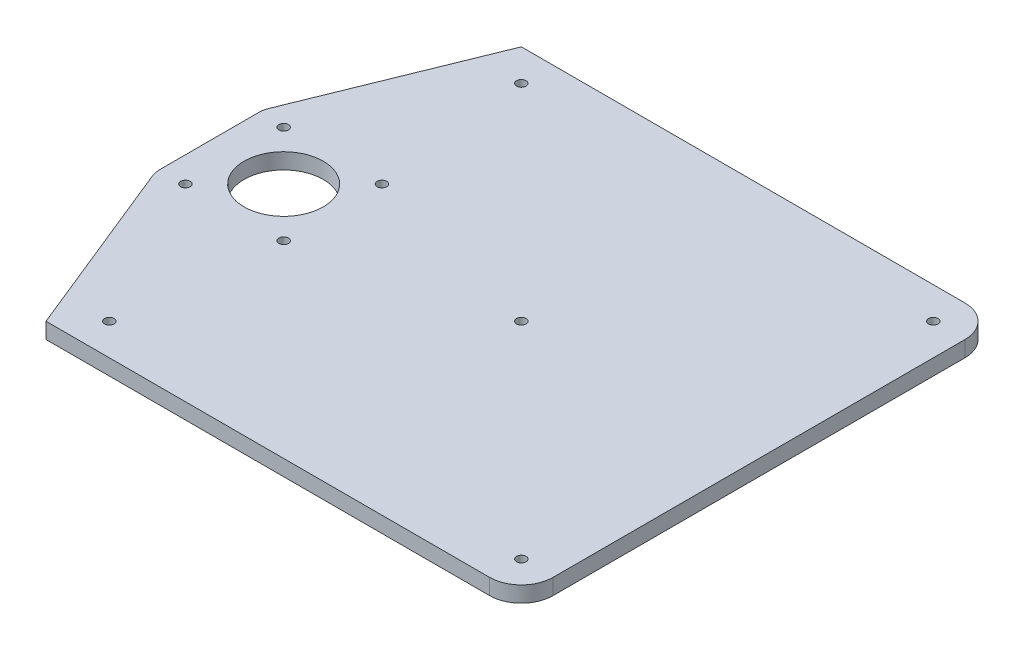
ISO-10303-21;
HEADER;
FILE_DESCRIPTION(('STEP AP214'),'2;1');
FILE_NAME('part.step','',(''),(''),'','','');
FILE_SCHEMA(('AUTOMOTIVE_DESIGN { 1 0 10303 214 1 1 1 1 }'));
ENDSEC;
DATA;
#1=APPLICATION_CONTEXT('core data for automotive mechanical design processes');
#2=APPLICATION_PROTOCOL_DEFINITION('international standard','automotive_design',2000,#1);
#3=PRODUCT_CONTEXT('',#1,'mechanical');
#4=PRODUCT('Part','Part','',(#3));
#5=PRODUCT_RELATED_PRODUCT_CATEGORY('part','',(#4));
#6=PRODUCT_DEFINITION_FORMATION('','',#4);
#7=PRODUCT_DEFINITION_CONTEXT('part definition',#1,'design');
#8=PRODUCT_DEFINITION('design','',#6,#7);
#9=PRODUCT_DEFINITION_SHAPE('','',#8);
#10=(LENGTH_UNIT() NAMED_UNIT(*) SI_UNIT(.MILLI.,.METRE.));
#11=(NAMED_UNIT(*) PLANE_ANGLE_UNIT() SI_UNIT($,.RADIAN.));
#12=(NAMED_UNIT(*) SI_UNIT($,.STERADIAN.) SOLID_ANGLE_UNIT());
#13=UNCERTAINTY_MEASURE_WITH_UNIT(LENGTH_MEASURE(1.E-05),#10,'distance_accuracy_value','');
#14=(GEOMETRIC_REPRESENTATION_CONTEXT(3) GLOBAL_UNCERTAINTY_ASSIGNED_CONTEXT((#13)) GLOBAL_UNIT_ASSIGNED_CONTEXT((#10,
#11,#12)) REPRESENTATION_CONTEXT('',''));
#15=CARTESIAN_POINT('',(0.,0.,0.));
#16=DIRECTION('',(0.,0.,1.));
#17=DIRECTION('',(1.,0.,0.));
#18=AXIS2_PLACEMENT_3D('',#15,#16,#17);
#19=CARTESIAN_POINT('',(65.,5.,65.));
#20=DIRECTION('',(0.,1.,0.));
#21=DIRECTION('',(0.,0.,1.));
#22=AXIS2_PLACEMENT_3D('',#19,#20,#21);
#23=PLANE('',#22);
#24=CARTESIAN_POINT('',(-65.,5.,65.));
#25=DIRECTION('',(0.,1.,0.));
#26=DIRECTION('',(0.,0.,1.));
#27=AXIS2_PLACEMENT_3D('',#24,#25,#26);
#28=CIRCLE('',#27,1.5);
#29=CARTESIAN_POINT('',(-65.,5.,66.5));
#30=VERTEX_POINT('',#29);
#31=EDGE_CURVE('E305',#30,#30,#28,.T.);
#32=ORIENTED_EDGE('',*,*,#31,.F.);
#33=EDGE_LOOP('',(#32));
#34=FACE_BOUND('',#33,.T.);
#35=CARTESIAN_POINT('',(65.,5.,-65.));
#36=DIRECTION('',(0.,1.,0.));
#37=DIRECTION('',(0.,0.,1.));
#38=AXIS2_PLACEMENT_3D('',#35,#36,#37);
#39=CIRCLE('',#38,1.5);
#40=CARTESIAN_POINT('',(65.,5.,-63.5));
#41=VERTEX_POINT('',#40);
#42=EDGE_CURVE('E289',#41,#41,#39,.T.);
#43=ORIENTED_EDGE('',*,*,#42,.F.);
#44=EDGE_LOOP('',(#43));
#45=FACE_BOUND('',#44,.T.);
#46=CARTESIAN_POINT('',(-65.,5.,-65.));
#47=DIRECTION('',(0.,1.,0.));
#48=DIRECTION('',(0.,0.,1.));
#49=AXIS2_PLACEMENT_3D('',#46,#47,#48);
#50=CIRCLE('',#49,1.5);
#51=CARTESIAN_POINT('',(-65.,5.,-63.5));
#52=VERTEX_POINT('',#51);
#53=EDGE_CURVE('E273',#52,#52,#50,.T.);
#54=ORIENTED_EDGE('',*,*,#53,.F.);
#55=EDGE_LOOP('',(#54));
#56=FACE_BOUND('',#55,.T.);
#57=CARTESIAN_POINT('',(-59.5,5.,15.5));
#58=DIRECTION('',(0.,1.,0.));
#59=DIRECTION('',(0.,0.,1.));
#60=AXIS2_PLACEMENT_3D('',#57,#58,#59);
#61=CIRCLE('',#60,1.5);
#62=CARTESIAN_POINT('',(-59.5,5.,17.));
#63=VERTEX_POINT('',#62);
#64=EDGE_CURVE('E257',#63,#63,#61,.T.);
#65=ORIENTED_EDGE('',*,*,#64,.F.);
#66=EDGE_LOOP('',(#65));
#67=FACE_BOUND('',#66,.T.);
#68=CARTESIAN_POINT('',(-90.5,5.,-15.5));
#69=DIRECTION('',(0.,1.,0.));
#70=DIRECTION('',(0.,0.,1.));
#71=AXIS2_PLACEMENT_3D('',#68,#69,#70);
#72=CIRCLE('',#71,1.5);
#73=CARTESIAN_POINT('',(-90.5,5.,-14.));
#74=VERTEX_POINT('',#73);
#75=EDGE_CURVE('E158',#74,#74,#72,.T.);
#76=ORIENTED_EDGE('',*,*,#75,.F.);
#77=EDGE_LOOP('',(#76));
#78=FACE_BOUND('',#77,.T.);
#79=DIRECTION('',(0.375857189718503,0.,0.926677599241996));
#80=VECTOR('',#79,1.);
#81=CARTESIAN_POINT('',(-97.913420793936,5.,18.506857517748));
#82=LINE('',#81,#80);
#83=CARTESIAN_POINT('',(-97.913420793936,5.,18.506857517748));
#84=VERTEX_POINT('',#83);
#85=CARTESIAN_POINT('',(-75.,5.,75.));
#86=VERTEX_POINT('',#85);
#87=EDGE_CURVE('E182',#84,#86,#82,.T.);
#88=ORIENTED_EDGE('',*,*,#87,.T.);
#89=DIRECTION('',(1.,0.,0.));
#90=VECTOR('',#89,1.);
#91=CARTESIAN_POINT('',(-75.,5.,75.));
#92=LINE('',#91,#90);
#93=CARTESIAN_POINT('',(65.,5.,75.));
#94=VERTEX_POINT('',#93);
#95=EDGE_CURVE('E106',#86,#94,#92,.T.);
#96=ORIENTED_EDGE('',*,*,#95,.T.);
#97=CARTESIAN_POINT('',(65.,5.,65.));
#98=DIRECTION('',(0.,1.,0.));
#99=DIRECTION('',(0.,0.,1.));
#100=AXIS2_PLACEMENT_3D('',#97,#98,#99);
#101=CIRCLE('',#100,10.);
#102=CARTESIAN_POINT('',(75.,5.,65.));
#103=VERTEX_POINT('',#102);
#104=EDGE_CURVE('E211',#94,#103,#101,.T.);
#105=ORIENTED_EDGE('',*,*,#104,.T.);
#106=DIRECTION('',(0.,0.,-1.));
#107=VECTOR('',#106,1.);
#108=CARTESIAN_POINT('',(75.,5.,65.));
#109=LINE('',#108,#107);
#110=CARTESIAN_POINT('',(75.,5.,-65.));
#111=VERTEX_POINT('',#110);
#112=EDGE_CURVE('E231',#103,#111,#109,.T.);
#113=ORIENTED_EDGE('',*,*,#112,.T.);
#114=CARTESIAN_POINT('',(65.,5.,-65.));
#115=DIRECTION('',(0.,1.,0.));
#116=DIRECTION('',(0.,0.,-1.));
#117=AXIS2_PLACEMENT_3D('',#114,#115,#116);
#118=CIRCLE('',#117,10.);
#119=CARTESIAN_POINT('',(65.,5.,-75.));
#120=VERTEX_POINT('',#119);
#121=EDGE_CURVE('E227',#111,#120,#118,.T.);
#122=ORIENTED_EDGE('',*,*,#121,.T.);
#123=DIRECTION('',(-1.,0.,0.));
#124=VECTOR('',#123,1.);
#125=CARTESIAN_POINT('',(-75.,5.,-75.));
#126=LINE('',#125,#124);
#127=CARTESIAN_POINT('',(-75.,5.,-75.));
#128=VERTEX_POINT('',#127);
#129=EDGE_CURVE('E230',#120,#128,#126,.T.);
#130=ORIENTED_EDGE('',*,*,#129,.T.);
#131=DIRECTION('',(-0.375857189718503,0.,0.926677599241996));
#132=VECTOR('',#131,1.);
#133=CARTESIAN_POINT('',(-97.913420793936,5.,-18.506857517748));
#134=LINE('',#133,#132);
#135=CARTESIAN_POINT('',(-97.913420793936,5.,-18.506857517748));
#136=VERTEX_POINT('',#135);
#137=EDGE_CURVE('E131',#128,#136,#134,.T.);
#138=ORIENTED_EDGE('',*,*,#137,.T.);
#139=CARTESIAN_POINT('',(-90.5,5.,-15.5));
#140=DIRECTION('',(0.,1.,0.));
#141=DIRECTION('',(0.,0.,-1.));
#142=AXIS2_PLACEMENT_3D('',#139,#140,#141);
#143=CIRCLE('',#142,7.99999999999999);
#144=CARTESIAN_POINT('',(-98.5,5.,-15.5));
#145=VERTEX_POINT('',#144);
#146=EDGE_CURVE('E125',#136,#145,#143,.T.);
#147=ORIENTED_EDGE('',*,*,#146,.T.);
#148=DIRECTION('',(0.,0.,1.));
#149=VECTOR('',#148,1.);
#150=CARTESIAN_POINT('',(-98.5,5.,15.5));
#151=LINE('',#150,#149);
#152=CARTESIAN_POINT('',(-98.5,5.,15.5));
#153=VERTEX_POINT('',#152);
#154=EDGE_CURVE('E129',#145,#153,#151,.T.);
#155=ORIENTED_EDGE('',*,*,#154,.T.);
#156=CARTESIAN_POINT('',(-90.5,5.,15.5));
#157=DIRECTION('',(0.,1.,0.));
#158=DIRECTION('',(0.,0.,1.));
#159=AXIS2_PLACEMENT_3D('',#156,#157,#158);
#160=CIRCLE('',#159,8.00000000000001);
#161=EDGE_CURVE('E57',#153,#84,#160,.T.);
#162=ORIENTED_EDGE('',*,*,#161,.T.);
#163=EDGE_LOOP('',(#88,#96,#105,#113,#122,#130,#138,#147,#155,#162));
#164=FACE_BOUND('',#163,.T.);
#165=CARTESIAN_POINT('',(-90.5,5.,15.5));
#166=DIRECTION('',(0.,1.,0.));
#167=DIRECTION('',(0.,0.,1.));
#168=AXIS2_PLACEMENT_3D('',#165,#166,#167);
#169=CIRCLE('',#168,1.50000000000001);
#170=CARTESIAN_POINT('',(-90.5,5.,17.));
#171=VERTEX_POINT('',#170);
#172=EDGE_CURVE('E249',#171,#171,#169,.T.);
#173=ORIENTED_EDGE('',*,*,#172,.F.);
#174=EDGE_LOOP('',(#173));
#175=FACE_BOUND('',#174,.T.);
#176=CARTESIAN_POINT('',(-59.5,5.,-15.5));
#177=DIRECTION('',(0.,1.,0.));
#178=DIRECTION('',(0.,0.,1.));
#179=AXIS2_PLACEMENT_3D('',#176,#177,#178);
#180=CIRCLE('',#179,1.5);
#181=CARTESIAN_POINT('',(-59.5,5.,-14.));
#182=VERTEX_POINT('',#181);
#183=EDGE_CURVE('E265',#182,#182,#180,.T.);
#184=ORIENTED_EDGE('',*,*,#183,.F.);
#185=EDGE_LOOP('',(#184));
#186=FACE_BOUND('',#185,.T.);
#187=CARTESIAN_POINT('',(-75.,5.,0.));
#188=DIRECTION('',(0.,1.,0.));
#189=DIRECTION('',(0.,0.,1.));
#190=AXIS2_PLACEMENT_3D('',#187,#188,#189);
#191=CIRCLE('',#190,12.5);
#192=CARTESIAN_POINT('',(-75.,5.,12.5));
#193=VERTEX_POINT('',#192);
#194=EDGE_CURVE('E281',#193,#193,#191,.T.);
#195=ORIENTED_EDGE('',*,*,#194,.F.);
#196=EDGE_LOOP('',(#195));
#197=FACE_BOUND('',#196,.T.);
#198=CARTESIAN_POINT('',(65.,5.,65.));
#199=DIRECTION('',(0.,1.,0.));
#200=DIRECTION('',(0.,0.,1.));
#201=AXIS2_PLACEMENT_3D('',#198,#199,#200);
#202=CIRCLE('',#201,1.5);
#203=CARTESIAN_POINT('',(65.,5.,66.5));
#204=VERTEX_POINT('',#203);
#205=EDGE_CURVE('E297',#204,#204,#202,.T.);
#206=ORIENTED_EDGE('',*,*,#205,.F.);
#207=EDGE_LOOP('',(#206));
#208=FACE_BOUND('',#207,.T.);
#209=CARTESIAN_POINT('',(0.,5.,0.));
#210=DIRECTION('',(0.,1.,0.));
#211=DIRECTION('',(0.,0.,1.));
#212=AXIS2_PLACEMENT_3D('',#209,#210,#211);
#213=CIRCLE('',#212,1.5);
#214=CARTESIAN_POINT('',(0.,5.,1.5));
#215=VERTEX_POINT('',#214);
#216=EDGE_CURVE('E313',#215,#215,#213,.T.);
#217=ORIENTED_EDGE('',*,*,#216,.F.);
#218=EDGE_LOOP('',(#217));
#219=FACE_BOUND('',#218,.T.);
#220=ADVANCED_FACE('F39',(#34,#45,#56,#67,#78,#164,#175,#186,#197,#208,#219),#23,.T.);
#221=CARTESIAN_POINT('',(65.,0.,65.));
#222=DIRECTION('',(0.,1.,0.));
#223=DIRECTION('',(0.,0.,1.));
#224=AXIS2_PLACEMENT_3D('',#221,#222,#223);
#225=PLANE('',#224);
#226=DIRECTION('',(0.375857189718503,0.,0.926677599241996));
#227=VECTOR('',#226,1.);
#228=CARTESIAN_POINT('',(-97.913420793936,0.,18.506857517748));
#229=LINE('',#228,#227);
#230=CARTESIAN_POINT('',(-97.913420793936,0.,18.506857517748));
#231=VERTEX_POINT('',#230);
#232=CARTESIAN_POINT('',(-75.,0.,75.));
#233=VERTEX_POINT('',#232);
#234=EDGE_CURVE('E153',#231,#233,#229,.T.);
#235=ORIENTED_EDGE('',*,*,#234,.F.);
#236=CARTESIAN_POINT('',(-90.5,0.,15.5));
#237=DIRECTION('',(0.,1.,0.));
#238=DIRECTION('',(0.,0.,1.));
#239=AXIS2_PLACEMENT_3D('',#236,#237,#238);
#240=CIRCLE('',#239,8.00000000000001);
#241=CARTESIAN_POINT('',(-98.5,0.,15.5));
#242=VERTEX_POINT('',#241);
#243=EDGE_CURVE('E98',#242,#231,#240,.T.);
#244=ORIENTED_EDGE('',*,*,#243,.F.);
#245=DIRECTION('',(0.,0.,1.));
#246=VECTOR('',#245,1.);
#247=CARTESIAN_POINT('',(-98.5,0.,15.5));
#248=LINE('',#247,#246);
#249=CARTESIAN_POINT('',(-98.5,0.,-15.5));
#250=VERTEX_POINT('',#249);
#251=EDGE_CURVE('E92',#250,#242,#248,.T.);
#252=ORIENTED_EDGE('',*,*,#251,.F.);
#253=CARTESIAN_POINT('',(-90.5,0.,-15.5));
#254=DIRECTION('',(0.,1.,0.));
#255=DIRECTION('',(0.,0.,-1.));
#256=AXIS2_PLACEMENT_3D('',#253,#254,#255);
#257=CIRCLE('',#256,7.99999999999999);
#258=CARTESIAN_POINT('',(-97.913420793936,0.,-18.506857517748));
#259=VERTEX_POINT('',#258);
#260=EDGE_CURVE('E140',#259,#250,#257,.T.);
#261=ORIENTED_EDGE('',*,*,#260,.F.);
#262=DIRECTION('',(-0.375857189718503,0.,0.926677599241996));
#263=VECTOR('',#262,1.);
#264=CARTESIAN_POINT('',(-97.913420793936,0.,-18.506857517748));
#265=LINE('',#264,#263);
#266=CARTESIAN_POINT('',(-75.,0.,-75.));
#267=VERTEX_POINT('',#266);
#268=EDGE_CURVE('E173',#267,#259,#265,.T.);
#269=ORIENTED_EDGE('',*,*,#268,.F.);
#270=DIRECTION('',(-1.,0.,0.));
#271=VECTOR('',#270,1.);
#272=CARTESIAN_POINT('',(-75.,0.,-75.));
#273=LINE('',#272,#271);
#274=CARTESIAN_POINT('',(65.,0.,-75.));
#275=VERTEX_POINT('',#274);
#276=EDGE_CURVE('E170',#275,#267,#273,.T.);
#277=ORIENTED_EDGE('',*,*,#276,.F.);
#278=CARTESIAN_POINT('',(65.,0.,-65.));
#279=DIRECTION('',(0.,1.,0.));
#280=DIRECTION('',(0.,0.,-1.));
#281=AXIS2_PLACEMENT_3D('',#278,#279,#280);
#282=CIRCLE('',#281,10.);
#283=CARTESIAN_POINT('',(75.,0.,-65.));
#284=VERTEX_POINT('',#283);
#285=EDGE_CURVE('E167',#284,#275,#282,.T.);
#286=ORIENTED_EDGE('',*,*,#285,.F.);
#287=DIRECTION('',(0.,0.,-1.));
#288=VECTOR('',#287,1.);
#289=CARTESIAN_POINT('',(75.,0.,65.));
#290=LINE('',#289,#288);
#291=CARTESIAN_POINT('',(75.,0.,65.));
#292=VERTEX_POINT('',#291);
#293=EDGE_CURVE('E164',#292,#284,#290,.T.);
#294=ORIENTED_EDGE('',*,*,#293,.F.);
#295=CARTESIAN_POINT('',(65.,0.,65.));
#296=DIRECTION('',(0.,1.,0.));
#297=DIRECTION('',(0.,0.,1.));
#298=AXIS2_PLACEMENT_3D('',#295,#296,#297);
#299=CIRCLE('',#298,10.);
#300=CARTESIAN_POINT('',(65.,0.,75.));
#301=VERTEX_POINT('',#300);
#302=EDGE_CURVE('E161',#301,#292,#299,.T.);
#303=ORIENTED_EDGE('',*,*,#302,.F.);
#304=DIRECTION('',(1.,0.,0.));
#305=VECTOR('',#304,1.);
#306=CARTESIAN_POINT('',(-75.,0.,75.));
#307=LINE('',#306,#305);
#308=EDGE_CURVE('E157',#233,#301,#307,.T.);
#309=ORIENTED_EDGE('',*,*,#308,.F.);
#310=EDGE_LOOP('',(#235,#244,#252,#261,#269,#277,#286,#294,#303,#309));
#311=FACE_BOUND('',#310,.T.);
#312=CARTESIAN_POINT('',(-90.5,0.,-15.5));
#313=DIRECTION('',(0.,1.,0.));
#314=DIRECTION('',(0.,0.,1.));
#315=AXIS2_PLACEMENT_3D('',#312,#313,#314);
#316=CIRCLE('',#315,1.5);
#317=CARTESIAN_POINT('',(-90.5,0.,-14.));
#318=VERTEX_POINT('',#317);
#319=EDGE_CURVE('E245',#318,#318,#316,.T.);
#320=ORIENTED_EDGE('',*,*,#319,.T.);
#321=EDGE_LOOP('',(#320));
#322=FACE_BOUND('',#321,.T.);
#323=CARTESIAN_POINT('',(-90.5,0.,15.5));
#324=DIRECTION('',(0.,1.,0.));
#325=DIRECTION('',(0.,0.,1.));
#326=AXIS2_PLACEMENT_3D('',#323,#324,#325);
#327=CIRCLE('',#326,1.50000000000001);
#328=CARTESIAN_POINT('',(-90.5,0.,17.));
#329=VERTEX_POINT('',#328);
#330=EDGE_CURVE('E253',#329,#329,#327,.T.);
#331=ORIENTED_EDGE('',*,*,#330,.T.);
#332=EDGE_LOOP('',(#331));
#333=FACE_BOUND('',#332,.T.);
#334=CARTESIAN_POINT('',(-59.5,0.,15.5));
#335=DIRECTION('',(0.,1.,0.));
#336=DIRECTION('',(0.,0.,1.));
#337=AXIS2_PLACEMENT_3D('',#334,#335,#336);
#338=CIRCLE('',#337,1.5);
#339=CARTESIAN_POINT('',(-59.5,0.,17.));
#340=VERTEX_POINT('',#339);
#341=EDGE_CURVE('E261',#340,#340,#338,.T.);
#342=ORIENTED_EDGE('',*,*,#341,.T.);
#343=EDGE_LOOP('',(#342));
#344=FACE_BOUND('',#343,.T.);
#345=CARTESIAN_POINT('',(-59.5,0.,-15.5));
#346=DIRECTION('',(0.,1.,0.));
#347=DIRECTION('',(0.,0.,1.));
#348=AXIS2_PLACEMENT_3D('',#345,#346,#347);
#349=CIRCLE('',#348,1.5);
#350=CARTESIAN_POINT('',(-59.5,0.,-14.));
#351=VERTEX_POINT('',#350);
#352=EDGE_CURVE('E269',#351,#351,#349,.T.);
#353=ORIENTED_EDGE('',*,*,#352,.T.);
#354=EDGE_LOOP('',(#353));
#355=FACE_BOUND('',#354,.T.);
#356=CARTESIAN_POINT('',(-65.,0.,-65.));
#357=DIRECTION('',(0.,1.,0.));
#358=DIRECTION('',(0.,0.,1.));
#359=AXIS2_PLACEMENT_3D('',#356,#357,#358);
#360=CIRCLE('',#359,1.5);
#361=CARTESIAN_POINT('',(-65.,0.,-63.5));
#362=VERTEX_POINT('',#361);
#363=EDGE_CURVE('E277',#362,#362,#360,.T.);
#364=ORIENTED_EDGE('',*,*,#363,.T.);
#365=EDGE_LOOP('',(#364));
#366=FACE_BOUND('',#365,.T.);
#367=CARTESIAN_POINT('',(-75.,0.,0.));
#368=DIRECTION('',(0.,1.,0.));
#369=DIRECTION('',(0.,0.,1.));
#370=AXIS2_PLACEMENT_3D('',#367,#368,#369);
#371=CIRCLE('',#370,12.5);
#372=CARTESIAN_POINT('',(-75.,0.,12.5));
#373=VERTEX_POINT('',#372);
#374=EDGE_CURVE('E285',#373,#373,#371,.T.);
#375=ORIENTED_EDGE('',*,*,#374,.T.);
#376=EDGE_LOOP('',(#375));
#377=FACE_BOUND('',#376,.T.);
#378=CARTESIAN_POINT('',(65.,0.,-65.));
#379=DIRECTION('',(0.,1.,0.));
#380=DIRECTION('',(0.,0.,1.));
#381=AXIS2_PLACEMENT_3D('',#378,#379,#380);
#382=CIRCLE('',#381,1.5);
#383=CARTESIAN_POINT('',(65.,0.,-63.5));
#384=VERTEX_POINT('',#383);
#385=EDGE_CURVE('E293',#384,#384,#382,.T.);
#386=ORIENTED_EDGE('',*,*,#385,.T.);
#387=EDGE_LOOP('',(#386));
#388=FACE_BOUND('',#387,.T.);
#389=CARTESIAN_POINT('',(65.,0.,65.));
#390=DIRECTION('',(0.,1.,0.));
#391=DIRECTION('',(0.,0.,1.));
#392=AXIS2_PLACEMENT_3D('',#389,#390,#391);
#393=CIRCLE('',#392,1.5);
#394=CARTESIAN_POINT('',(65.,0.,66.5));
#395=VERTEX_POINT('',#394);
#396=EDGE_CURVE('E301',#395,#395,#393,.T.);
#397=ORIENTED_EDGE('',*,*,#396,.T.);
#398=EDGE_LOOP('',(#397));
#399=FACE_BOUND('',#398,.T.);
#400=CARTESIAN_POINT('',(-65.,0.,65.));
#401=DIRECTION('',(0.,1.,0.));
#402=DIRECTION('',(0.,0.,1.));
#403=AXIS2_PLACEMENT_3D('',#400,#401,#402);
#404=CIRCLE('',#403,1.5);
#405=CARTESIAN_POINT('',(-65.,0.,66.5));
#406=VERTEX_POINT('',#405);
#407=EDGE_CURVE('E309',#406,#406,#404,.T.);
#408=ORIENTED_EDGE('',*,*,#407,.T.);
#409=EDGE_LOOP('',(#408));
#410=FACE_BOUND('',#409,.T.);
#411=CARTESIAN_POINT('',(0.,0.,0.));
#412=DIRECTION('',(0.,1.,0.));
#413=DIRECTION('',(0.,0.,1.));
#414=AXIS2_PLACEMENT_3D('',#411,#412,#413);
#415=CIRCLE('',#414,1.5);
#416=CARTESIAN_POINT('',(0.,0.,1.5));
#417=VERTEX_POINT('',#416);
#418=EDGE_CURVE('E317',#417,#417,#415,.T.);
#419=ORIENTED_EDGE('',*,*,#418,.T.);
#420=EDGE_LOOP('',(#419));
#421=FACE_BOUND('',#420,.T.);
#422=ADVANCED_FACE('F215',(#311,#322,#333,#344,#355,#366,#377,#388,#399,#410,#421),#225,.F.);
#423=CARTESIAN_POINT('',(-97.913420793936,5.,18.506857517748));
#424=DIRECTION('',(0.926677599241996,0.,-0.375857189718503));
#425=DIRECTION('',(-0.375857189718503,0.,-0.926677599241996));
#426=AXIS2_PLACEMENT_3D('',#423,#424,#425);
#427=PLANE('',#426);
#428=ORIENTED_EDGE('',*,*,#234,.T.);
#429=DIRECTION('',(0.,-1.,0.));
#430=VECTOR('',#429,1.);
#431=CARTESIAN_POINT('',(-75.,5.,75.));
#432=LINE('',#431,#430);
#433=EDGE_CURVE('E11',#86,#233,#432,.T.);
#434=ORIENTED_EDGE('',*,*,#433,.F.);
#435=ORIENTED_EDGE('',*,*,#87,.F.);
#436=DIRECTION('',(0.,-1.,0.));
#437=VECTOR('',#436,1.);
#438=CARTESIAN_POINT('',(-97.913420793936,5.,18.506857517748));
#439=LINE('',#438,#437);
#440=EDGE_CURVE('E149',#84,#231,#439,.T.);
#441=ORIENTED_EDGE('',*,*,#440,.T.);
#442=EDGE_LOOP('',(#428,#434,#435,#441));
#443=FACE_BOUND('',#442,.T.);
#444=ADVANCED_FACE('F41',(#443),#427,.F.);
#445=CARTESIAN_POINT('',(-75.,5.,75.));
#446=DIRECTION('',(0.,0.,-1.));
#447=DIRECTION('',(-1.,0.,0.));
#448=AXIS2_PLACEMENT_3D('',#445,#446,#447);
#449=PLANE('',#448);
#450=ORIENTED_EDGE('',*,*,#308,.T.);
#451=DIRECTION('',(0.,-1.,0.));
#452=VECTOR('',#451,1.);
#453=CARTESIAN_POINT('',(65.,5.,75.));
#454=LINE('',#453,#452);
#455=EDGE_CURVE('E49',#94,#301,#454,.T.);
#456=ORIENTED_EDGE('',*,*,#455,.F.);
#457=ORIENTED_EDGE('',*,*,#95,.F.);
#458=ORIENTED_EDGE('',*,*,#433,.T.);
#459=EDGE_LOOP('',(#450,#456,#457,#458));
#460=FACE_BOUND('',#459,.T.);
#461=ADVANCED_FACE('F361',(#460),#449,.F.);
#462=CARTESIAN_POINT('',(65.,5.,65.));
#463=DIRECTION('',(0.,-1.,0.));
#464=DIRECTION('',(0.,0.,-1.));
#465=AXIS2_PLACEMENT_3D('',#462,#463,#464);
#466=CYLINDRICAL_SURFACE('',#465,10.);
#467=ORIENTED_EDGE('',*,*,#302,.T.);
#468=DIRECTION('',(0.,-1.,0.));
#469=VECTOR('',#468,1.);
#470=CARTESIAN_POINT('',(75.,5.,65.));
#471=LINE('',#470,#469);
#472=EDGE_CURVE('E201',#103,#292,#471,.T.);
#473=ORIENTED_EDGE('',*,*,#472,.F.);
#474=ORIENTED_EDGE('',*,*,#104,.F.);
#475=ORIENTED_EDGE('',*,*,#455,.T.);
#476=EDGE_LOOP('',(#467,#473,#474,#475));
#477=FACE_BOUND('',#476,.T.);
#478=ADVANCED_FACE('F209',(#477),#466,.T.);
#479=CARTESIAN_POINT('',(75.,5.,65.));
#480=DIRECTION('',(-1.,0.,0.));
#481=DIRECTION('',(0.,0.,1.));
#482=AXIS2_PLACEMENT_3D('',#479,#480,#481);
#483=PLANE('',#482);
#484=ORIENTED_EDGE('',*,*,#293,.T.);
#485=DIRECTION('',(0.,-1.,0.));
#486=VECTOR('',#485,1.);
#487=CARTESIAN_POINT('',(75.,5.,-65.));
#488=LINE('',#487,#486);
#489=EDGE_CURVE('E197',#111,#284,#488,.T.);
#490=ORIENTED_EDGE('',*,*,#489,.F.);
#491=ORIENTED_EDGE('',*,*,#112,.F.);
#492=ORIENTED_EDGE('',*,*,#472,.T.);
#493=EDGE_LOOP('',(#484,#490,#491,#492));
#494=FACE_BOUND('',#493,.T.);
#495=ADVANCED_FACE('F221',(#494),#483,.F.);
#496=CARTESIAN_POINT('',(65.,5.,-65.));
#497=DIRECTION('',(0.,-1.,0.));
#498=DIRECTION('',(0.,0.,-1.));
#499=AXIS2_PLACEMENT_3D('',#496,#497,#498);
#500=CYLINDRICAL_SURFACE('',#499,10.);
#501=ORIENTED_EDGE('',*,*,#285,.T.);
#502=DIRECTION('',(0.,-1.,0.));
#503=VECTOR('',#502,1.);
#504=CARTESIAN_POINT('',(65.,5.,-75.));
#505=LINE('',#504,#503);
#506=EDGE_CURVE('E193',#120,#275,#505,.T.);
#507=ORIENTED_EDGE('',*,*,#506,.F.);
#508=ORIENTED_EDGE('',*,*,#121,.F.);
#509=ORIENTED_EDGE('',*,*,#489,.T.);
#510=EDGE_LOOP('',(#501,#507,#508,#509));
#511=FACE_BOUND('',#510,.T.);
#512=ADVANCED_FACE('F225',(#511),#500,.T.);
#513=CARTESIAN_POINT('',(-75.,5.,-75.));
#514=DIRECTION('',(0.,0.,1.));
#515=DIRECTION('',(1.,0.,0.));
#516=AXIS2_PLACEMENT_3D('',#513,#514,#515);
#517=PLANE('',#516);
#518=ORIENTED_EDGE('',*,*,#276,.T.);
#519=DIRECTION('',(0.,-1.,0.));
#520=VECTOR('',#519,1.);
#521=CARTESIAN_POINT('',(-75.,5.,-75.));
#522=LINE('',#521,#520);
#523=EDGE_CURVE('E189',#128,#267,#522,.T.);
#524=ORIENTED_EDGE('',*,*,#523,.F.);
#525=ORIENTED_EDGE('',*,*,#129,.F.);
#526=ORIENTED_EDGE('',*,*,#506,.T.);
#527=EDGE_LOOP('',(#518,#524,#525,#526));
#528=FACE_BOUND('',#527,.T.);
#529=ADVANCED_FACE('F351',(#528),#517,.F.);
#530=CARTESIAN_POINT('',(-97.913420793936,5.,-18.506857517748));
#531=DIRECTION('',(0.926677599241996,0.,0.375857189718503));
#532=DIRECTION('',(0.375857189718503,0.,-0.926677599241996));
#533=AXIS2_PLACEMENT_3D('',#530,#531,#532);
#534=PLANE('',#533);
#535=ORIENTED_EDGE('',*,*,#268,.T.);
#536=DIRECTION('',(0.,-1.,0.));
#537=VECTOR('',#536,1.);
#538=CARTESIAN_POINT('',(-97.913420793936,5.,-18.506857517748));
#539=LINE('',#538,#537);
#540=EDGE_CURVE('E142',#136,#259,#539,.T.);
#541=ORIENTED_EDGE('',*,*,#540,.F.);
#542=ORIENTED_EDGE('',*,*,#137,.F.);
#543=ORIENTED_EDGE('',*,*,#523,.T.);
#544=EDGE_LOOP('',(#535,#541,#542,#543));
#545=FACE_BOUND('',#544,.T.);
#546=ADVANCED_FACE('F348',(#545),#534,.F.);
#547=CARTESIAN_POINT('',(-90.5,5.,-15.5));
#548=DIRECTION('',(0.,-1.,0.));
#549=DIRECTION('',(0.,0.,-1.));
#550=AXIS2_PLACEMENT_3D('',#547,#548,#549);
#551=CYLINDRICAL_SURFACE('',#550,7.99999999999999);
#552=ORIENTED_EDGE('',*,*,#260,.T.);
#553=DIRECTION('',(0.,-1.,0.));
#554=VECTOR('',#553,1.);
#555=CARTESIAN_POINT('',(-98.5,5.,-15.5));
#556=LINE('',#555,#554);
#557=EDGE_CURVE('E137',#145,#250,#556,.T.);
#558=ORIENTED_EDGE('',*,*,#557,.F.);
#559=ORIENTED_EDGE('',*,*,#146,.F.);
#560=ORIENTED_EDGE('',*,*,#540,.T.);
#561=EDGE_LOOP('',(#552,#558,#559,#560));
#562=FACE_BOUND('',#561,.T.);
#563=ADVANCED_FACE('F138',(#562),#551,.T.);
#564=CARTESIAN_POINT('',(-98.5,5.,15.5));
#565=DIRECTION('',(1.,0.,0.));
#566=DIRECTION('',(0.,0.,-1.));
#567=AXIS2_PLACEMENT_3D('',#564,#565,#566);
#568=PLANE('',#567);
#569=ORIENTED_EDGE('',*,*,#251,.T.);
#570=DIRECTION('',(0.,-1.,0.));
#571=VECTOR('',#570,1.);
#572=CARTESIAN_POINT('',(-98.5,5.,15.5));
#573=LINE('',#572,#571);
#574=EDGE_CURVE('E143',#153,#242,#573,.T.);
#575=ORIENTED_EDGE('',*,*,#574,.F.);
#576=ORIENTED_EDGE('',*,*,#154,.F.);
#577=ORIENTED_EDGE('',*,*,#557,.T.);
#578=EDGE_LOOP('',(#569,#575,#576,#577));
#579=FACE_BOUND('',#578,.T.);
#580=ADVANCED_FACE('F145',(#579),#568,.F.);
#581=CARTESIAN_POINT('',(-90.5,5.,15.5));
#582=DIRECTION('',(0.,-1.,0.));
#583=DIRECTION('',(0.,0.,-1.));
#584=AXIS2_PLACEMENT_3D('',#581,#582,#583);
#585=CYLINDRICAL_SURFACE('',#584,8.00000000000001);
#586=ORIENTED_EDGE('',*,*,#243,.T.);
#587=ORIENTED_EDGE('',*,*,#440,.F.);
#588=ORIENTED_EDGE('',*,*,#161,.F.);
#589=ORIENTED_EDGE('',*,*,#574,.T.);
#590=EDGE_LOOP('',(#586,#587,#588,#589));
#591=FACE_BOUND('',#590,.T.);
#592=ADVANCED_FACE('F341',(#591),#585,.T.);
#593=CARTESIAN_POINT('',(-90.5,5.,-15.5));
#594=DIRECTION('',(0.,-1.,0.));
#595=DIRECTION('',(0.,0.,-1.));
#596=AXIS2_PLACEMENT_3D('',#593,#594,#595);
#597=CYLINDRICAL_SURFACE('',#596,1.5);
#598=ORIENTED_EDGE('',*,*,#75,.T.);
#599=EDGE_LOOP('',(#598));
#600=FACE_BOUND('',#599,.T.);
#601=ORIENTED_EDGE('',*,*,#319,.F.);
#602=EDGE_LOOP('',(#601));
#603=FACE_BOUND('',#602,.T.);
#604=ADVANCED_FACE('F338',(#600,#603),#597,.F.);
#605=CARTESIAN_POINT('',(-90.5,5.,15.5));
#606=DIRECTION('',(0.,-1.,0.));
#607=DIRECTION('',(0.,0.,-1.));
#608=AXIS2_PLACEMENT_3D('',#605,#606,#607);
#609=CYLINDRICAL_SURFACE('',#608,1.50000000000001);
#610=ORIENTED_EDGE('',*,*,#172,.T.);
#611=EDGE_LOOP('',(#610));
#612=FACE_BOUND('',#611,.T.);
#613=ORIENTED_EDGE('',*,*,#330,.F.);
#614=EDGE_LOOP('',(#613));
#615=FACE_BOUND('',#614,.T.);
#616=ADVANCED_FACE('F437',(#612,#615),#609,.F.);
#617=CARTESIAN_POINT('',(-59.5,5.,15.5));
#618=DIRECTION('',(0.,-1.,0.));
#619=DIRECTION('',(0.,0.,-1.));
#620=AXIS2_PLACEMENT_3D('',#617,#618,#619);
#621=CYLINDRICAL_SURFACE('',#620,1.5);
#622=ORIENTED_EDGE('',*,*,#64,.T.);
#623=EDGE_LOOP('',(#622));
#624=FACE_BOUND('',#623,.T.);
#625=ORIENTED_EDGE('',*,*,#341,.F.);
#626=EDGE_LOOP('',(#625));
#627=FACE_BOUND('',#626,.T.);
#628=ADVANCED_FACE('F445',(#624,#627),#621,.F.);
#629=CARTESIAN_POINT('',(-59.5,5.,-15.5));
#630=DIRECTION('',(0.,-1.,0.));
#631=DIRECTION('',(0.,0.,-1.));
#632=AXIS2_PLACEMENT_3D('',#629,#630,#631);
#633=CYLINDRICAL_SURFACE('',#632,1.5);
#634=ORIENTED_EDGE('',*,*,#183,.T.);
#635=EDGE_LOOP('',(#634));
#636=FACE_BOUND('',#635,.T.);
#637=ORIENTED_EDGE('',*,*,#352,.F.);
#638=EDGE_LOOP('',(#637));
#639=FACE_BOUND('',#638,.T.);
#640=ADVANCED_FACE('F453',(#636,#639),#633,.F.);
#641=CARTESIAN_POINT('',(-65.,5.,-65.));
#642=DIRECTION('',(0.,-1.,0.));
#643=DIRECTION('',(0.,0.,-1.));
#644=AXIS2_PLACEMENT_3D('',#641,#642,#643);
#645=CYLINDRICAL_SURFACE('',#644,1.5);
#646=ORIENTED_EDGE('',*,*,#53,.T.);
#647=EDGE_LOOP('',(#646));
#648=FACE_BOUND('',#647,.T.);
#649=ORIENTED_EDGE('',*,*,#363,.F.);
#650=EDGE_LOOP('',(#649));
#651=FACE_BOUND('',#650,.T.);
#652=ADVANCED_FACE('F462',(#648,#651),#645,.F.);
#653=CARTESIAN_POINT('',(-75.,5.,0.));
#654=DIRECTION('',(0.,-1.,0.));
#655=DIRECTION('',(0.,0.,-1.));
#656=AXIS2_PLACEMENT_3D('',#653,#654,#655);
#657=CYLINDRICAL_SURFACE('',#656,12.5);
#658=ORIENTED_EDGE('',*,*,#194,.T.);
#659=EDGE_LOOP('',(#658));
#660=FACE_BOUND('',#659,.T.);
#661=ORIENTED_EDGE('',*,*,#374,.F.);
#662=EDGE_LOOP('',(#661));
#663=FACE_BOUND('',#662,.T.);
#664=ADVANCED_FACE('F471',(#660,#663),#657,.F.);
#665=CARTESIAN_POINT('',(65.,5.,-65.));
#666=DIRECTION('',(0.,-1.,0.));
#667=DIRECTION('',(0.,0.,-1.));
#668=AXIS2_PLACEMENT_3D('',#665,#666,#667);
#669=CYLINDRICAL_SURFACE('',#668,1.5);
#670=ORIENTED_EDGE('',*,*,#42,.T.);
#671=EDGE_LOOP('',(#670));
#672=FACE_BOUND('',#671,.T.);
#673=ORIENTED_EDGE('',*,*,#385,.F.);
#674=EDGE_LOOP('',(#673));
#675=FACE_BOUND('',#674,.T.);
#676=ADVANCED_FACE('F480',(#672,#675),#669,.F.);
#677=CARTESIAN_POINT('',(65.,5.,65.));
#678=DIRECTION('',(0.,-1.,0.));
#679=DIRECTION('',(0.,0.,-1.));
#680=AXIS2_PLACEMENT_3D('',#677,#678,#679);
#681=CYLINDRICAL_SURFACE('',#680,1.5);
#682=ORIENTED_EDGE('',*,*,#205,.T.);
#683=EDGE_LOOP('',(#682));
#684=FACE_BOUND('',#683,.T.);
#685=ORIENTED_EDGE('',*,*,#396,.F.);
#686=EDGE_LOOP('',(#685));
#687=FACE_BOUND('',#686,.T.);
#688=ADVANCED_FACE('F489',(#684,#687),#681,.F.);
#689=CARTESIAN_POINT('',(-65.,5.,65.));
#690=DIRECTION('',(0.,-1.,0.));
#691=DIRECTION('',(0.,0.,-1.));
#692=AXIS2_PLACEMENT_3D('',#689,#690,#691);
#693=CYLINDRICAL_SURFACE('',#692,1.5);
#694=ORIENTED_EDGE('',*,*,#31,.T.);
#695=EDGE_LOOP('',(#694));
#696=FACE_BOUND('',#695,.T.);
#697=ORIENTED_EDGE('',*,*,#407,.F.);
#698=EDGE_LOOP('',(#697));
#699=FACE_BOUND('',#698,.T.);
#700=ADVANCED_FACE('F498',(#696,#699),#693,.F.);
#701=CARTESIAN_POINT('',(0.,5.,0.));
#702=DIRECTION('',(0.,-1.,0.));
#703=DIRECTION('',(0.,0.,-1.));
#704=AXIS2_PLACEMENT_3D('',#701,#702,#703);
#705=CYLINDRICAL_SURFACE('',#704,1.5);
#706=ORIENTED_EDGE('',*,*,#216,.T.);
#707=EDGE_LOOP('',(#706));
#708=FACE_BOUND('',#707,.T.);
#709=ORIENTED_EDGE('',*,*,#418,.F.);
#710=EDGE_LOOP('',(#709));
#711=FACE_BOUND('',#710,.T.);
#712=ADVANCED_FACE('F325',(#708,#711),#705,.F.);
#713=CLOSED_SHELL('',(#220,#422,#444,#461,#478,#495,#512,#529,#546,#563,#580,#592,#604,#616,
#628,#640,#652,#664,#676,#688,#700,#712));
#714=MANIFOLD_SOLID_BREP('B2',#713);
#715=ADVANCED_BREP_SHAPE_REPRESENTATION('',(#18,#714),#14);
#716=SHAPE_DEFINITION_REPRESENTATION(#9,#715);
ENDSEC;
END-ISO-10303-21;
